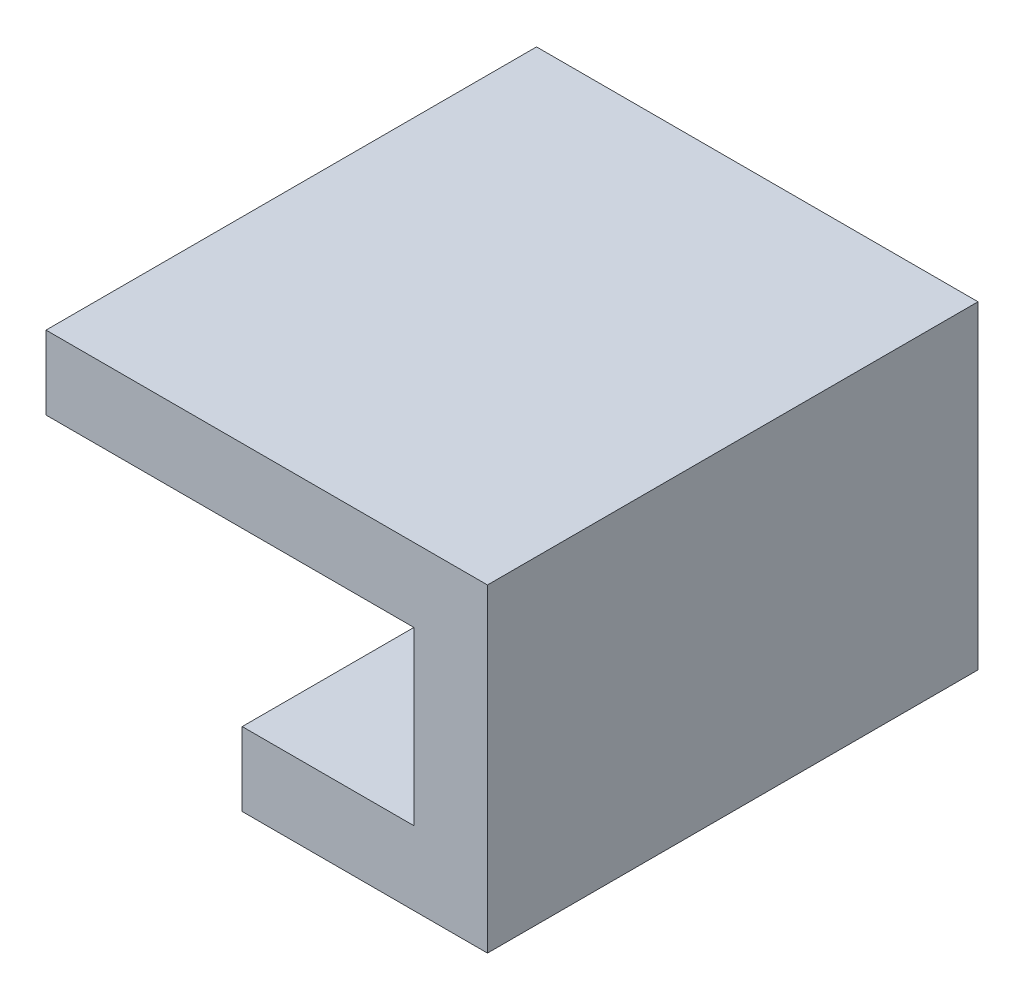
ISO-10303-21;
HEADER;
FILE_DESCRIPTION(('STEP AP214'),'2;1');
FILE_NAME('part.step','',(''),(''),'','','');
FILE_SCHEMA(('AUTOMOTIVE_DESIGN { 1 0 10303 214 1 1 1 1 }'));
ENDSEC;
DATA;
#1=APPLICATION_CONTEXT('core data for automotive mechanical design processes');
#2=APPLICATION_PROTOCOL_DEFINITION('international standard','automotive_design',2000,#1);
#3=PRODUCT_CONTEXT('',#1,'mechanical');
#4=PRODUCT('Part','Part','',(#3));
#5=PRODUCT_RELATED_PRODUCT_CATEGORY('part','',(#4));
#6=PRODUCT_DEFINITION_FORMATION('','',#4);
#7=PRODUCT_DEFINITION_CONTEXT('part definition',#1,'design');
#8=PRODUCT_DEFINITION('design','',#6,#7);
#9=PRODUCT_DEFINITION_SHAPE('','',#8);
#10=(LENGTH_UNIT() NAMED_UNIT(*) SI_UNIT(.MILLI.,.METRE.));
#11=(NAMED_UNIT(*) PLANE_ANGLE_UNIT() SI_UNIT($,.RADIAN.));
#12=(NAMED_UNIT(*) SI_UNIT($,.STERADIAN.) SOLID_ANGLE_UNIT());
#13=UNCERTAINTY_MEASURE_WITH_UNIT(LENGTH_MEASURE(1.E-05),#10,'distance_accuracy_value','');
#14=(GEOMETRIC_REPRESENTATION_CONTEXT(3) GLOBAL_UNCERTAINTY_ASSIGNED_CONTEXT((#13)) GLOBAL_UNIT_ASSIGNED_CONTEXT((#10,
#11,#12)) REPRESENTATION_CONTEXT('',''));
#15=CARTESIAN_POINT('',(0.,0.,0.));
#16=DIRECTION('',(0.,0.,1.));
#17=DIRECTION('',(1.,0.,0.));
#18=AXIS2_PLACEMENT_3D('',#15,#16,#17);
#19=CARTESIAN_POINT('',(194.687130801062,-60.8116928073628,10.));
#20=DIRECTION('',(-1.,0.,0.));
#21=DIRECTION('',(0.,0.,1.));
#22=AXIS2_PLACEMENT_3D('',#19,#20,#21);
#23=PLANE('',#22);
#24=DIRECTION('',(0.,1.,0.));
#25=VECTOR('',#24,1.);
#26=CARTESIAN_POINT('',(194.687130801062,-60.8116928073628,0.));
#27=LINE('',#26,#25);
#28=CARTESIAN_POINT('',(194.687130801062,-60.8116928073628,0.));
#29=VERTEX_POINT('',#28);
#30=CARTESIAN_POINT('',(194.687130801062,-57.3116928073628,0.));
#31=VERTEX_POINT('',#30);
#32=EDGE_CURVE('E144',#29,#31,#27,.T.);
#33=ORIENTED_EDGE('',*,*,#32,.F.);
#34=DIRECTION('',(0.,0.,-1.));
#35=VECTOR('',#34,1.);
#36=CARTESIAN_POINT('',(194.687130801062,-60.8116928073628,10.));
#37=LINE('',#36,#35);
#38=CARTESIAN_POINT('',(194.687130801062,-60.8116928073628,10.));
#39=VERTEX_POINT('',#38);
#40=EDGE_CURVE('E11',#39,#29,#37,.T.);
#41=ORIENTED_EDGE('',*,*,#40,.F.);
#42=DIRECTION('',(0.,1.,0.));
#43=VECTOR('',#42,1.);
#44=CARTESIAN_POINT('',(194.687130801062,-60.8116928073628,10.));
#45=LINE('',#44,#43);
#46=CARTESIAN_POINT('',(194.687130801062,-57.3116928073628,10.));
#47=VERTEX_POINT('',#46);
#48=EDGE_CURVE('E171',#39,#47,#45,.T.);
#49=ORIENTED_EDGE('',*,*,#48,.T.);
#50=DIRECTION('',(0.,0.,-1.));
#51=VECTOR('',#50,1.);
#52=CARTESIAN_POINT('',(194.687130801062,-57.3116928073628,10.));
#53=LINE('',#52,#51);
#54=EDGE_CURVE('E48',#47,#31,#53,.T.);
#55=ORIENTED_EDGE('',*,*,#54,.T.);
#56=EDGE_LOOP('',(#33,#41,#49,#55));
#57=FACE_BOUND('',#56,.T.);
#58=ADVANCED_FACE('F45',(#57),#23,.T.);
#59=CARTESIAN_POINT('',(191.187130801062,-60.8116928073628,10.));
#60=DIRECTION('',(0.,1.,0.));
#61=DIRECTION('',(0.,0.,1.));
#62=AXIS2_PLACEMENT_3D('',#59,#60,#61);
#63=PLANE('',#62);
#64=DIRECTION('',(1.,0.,0.));
#65=VECTOR('',#64,1.);
#66=CARTESIAN_POINT('',(191.187130801062,-60.8116928073628,0.));
#67=LINE('',#66,#65);
#68=CARTESIAN_POINT('',(191.187130801062,-60.8116928073628,0.));
#69=VERTEX_POINT('',#68);
#70=EDGE_CURVE('E168',#69,#29,#67,.T.);
#71=ORIENTED_EDGE('',*,*,#70,.F.);
#72=DIRECTION('',(0.,0.,-1.));
#73=VECTOR('',#72,1.);
#74=CARTESIAN_POINT('',(191.187130801062,-60.8116928073628,10.));
#75=LINE('',#74,#73);
#76=CARTESIAN_POINT('',(191.187130801062,-60.8116928073628,10.));
#77=VERTEX_POINT('',#76);
#78=EDGE_CURVE('E55',#77,#69,#75,.T.);
#79=ORIENTED_EDGE('',*,*,#78,.F.);
#80=DIRECTION('',(1.,0.,0.));
#81=VECTOR('',#80,1.);
#82=CARTESIAN_POINT('',(191.187130801062,-60.8116928073628,10.));
#83=LINE('',#82,#81);
#84=EDGE_CURVE('E137',#77,#39,#83,.T.);
#85=ORIENTED_EDGE('',*,*,#84,.T.);
#86=ORIENTED_EDGE('',*,*,#40,.T.);
#87=EDGE_LOOP('',(#71,#79,#85,#86));
#88=FACE_BOUND('',#87,.T.);
#89=ADVANCED_FACE('F190',(#88),#63,.T.);
#90=CARTESIAN_POINT('',(191.187130801062,-62.3116928073628,10.));
#91=DIRECTION('',(-1.,0.,0.));
#92=DIRECTION('',(0.,0.,1.));
#93=AXIS2_PLACEMENT_3D('',#90,#91,#92);
#94=PLANE('',#93);
#95=DIRECTION('',(0.,1.,0.));
#96=VECTOR('',#95,1.);
#97=CARTESIAN_POINT('',(191.187130801062,-62.3116928073628,0.));
#98=LINE('',#97,#96);
#99=CARTESIAN_POINT('',(191.187130801062,-62.3116928073628,0.));
#100=VERTEX_POINT('',#99);
#101=EDGE_CURVE('E121',#100,#69,#98,.T.);
#102=ORIENTED_EDGE('',*,*,#101,.F.);
#103=DIRECTION('',(0.,0.,-1.));
#104=VECTOR('',#103,1.);
#105=CARTESIAN_POINT('',(191.187130801062,-62.3116928073628,10.));
#106=LINE('',#105,#104);
#107=CARTESIAN_POINT('',(191.187130801062,-62.3116928073628,10.));
#108=VERTEX_POINT('',#107);
#109=EDGE_CURVE('E115',#108,#100,#106,.T.);
#110=ORIENTED_EDGE('',*,*,#109,.F.);
#111=DIRECTION('',(0.,1.,0.));
#112=VECTOR('',#111,1.);
#113=CARTESIAN_POINT('',(191.187130801062,-62.3116928073628,10.));
#114=LINE('',#113,#112);
#115=EDGE_CURVE('E119',#108,#77,#114,.T.);
#116=ORIENTED_EDGE('',*,*,#115,.T.);
#117=ORIENTED_EDGE('',*,*,#78,.T.);
#118=EDGE_LOOP('',(#102,#110,#116,#117));
#119=FACE_BOUND('',#118,.T.);
#120=ADVANCED_FACE('F117',(#119),#94,.T.);
#121=CARTESIAN_POINT('',(191.187130801062,-62.3116928073628,10.));
#122=DIRECTION('',(0.,1.,0.));
#123=DIRECTION('',(0.,0.,1.));
#124=AXIS2_PLACEMENT_3D('',#121,#122,#123);
#125=PLANE('',#124);
#126=DIRECTION('',(1.,0.,0.));
#127=VECTOR('',#126,1.);
#128=CARTESIAN_POINT('',(191.187130801062,-62.3116928073628,0.));
#129=LINE('',#128,#127);
#130=CARTESIAN_POINT('',(196.187130801062,-62.3116928073628,0.));
#131=VERTEX_POINT('',#130);
#132=EDGE_CURVE('E163',#100,#131,#129,.T.);
#133=ORIENTED_EDGE('',*,*,#132,.T.);
#134=DIRECTION('',(0.,0.,-1.));
#135=VECTOR('',#134,1.);
#136=CARTESIAN_POINT('',(196.187130801062,-62.3116928073628,10.));
#137=LINE('',#136,#135);
#138=CARTESIAN_POINT('',(196.187130801062,-62.3116928073628,10.));
#139=VERTEX_POINT('',#138);
#140=EDGE_CURVE('E125',#139,#131,#137,.T.);
#141=ORIENTED_EDGE('',*,*,#140,.F.);
#142=DIRECTION('',(1.,0.,0.));
#143=VECTOR('',#142,1.);
#144=CARTESIAN_POINT('',(191.187130801062,-62.3116928073628,10.));
#145=LINE('',#144,#143);
#146=EDGE_CURVE('E128',#108,#139,#145,.T.);
#147=ORIENTED_EDGE('',*,*,#146,.F.);
#148=ORIENTED_EDGE('',*,*,#109,.T.);
#149=EDGE_LOOP('',(#133,#141,#147,#148));
#150=FACE_BOUND('',#149,.T.);
#151=ADVANCED_FACE('F129',(#150),#125,.F.);
#152=CARTESIAN_POINT('',(196.187130801062,-62.3116928073628,10.));
#153=DIRECTION('',(-1.,0.,0.));
#154=DIRECTION('',(0.,0.,1.));
#155=AXIS2_PLACEMENT_3D('',#152,#153,#154);
#156=PLANE('',#155);
#157=DIRECTION('',(0.,1.,0.));
#158=VECTOR('',#157,1.);
#159=CARTESIAN_POINT('',(196.187130801062,-62.3116928073628,0.));
#160=LINE('',#159,#158);
#161=CARTESIAN_POINT('',(196.187130801062,-55.8116928073628,0.));
#162=VERTEX_POINT('',#161);
#163=EDGE_CURVE('E160',#131,#162,#160,.T.);
#164=ORIENTED_EDGE('',*,*,#163,.T.);
#165=DIRECTION('',(0.,0.,-1.));
#166=VECTOR('',#165,1.);
#167=CARTESIAN_POINT('',(196.187130801062,-55.8116928073628,10.));
#168=LINE('',#167,#166);
#169=CARTESIAN_POINT('',(196.187130801062,-55.8116928073628,10.));
#170=VERTEX_POINT('',#169);
#171=EDGE_CURVE('E177',#170,#162,#168,.T.);
#172=ORIENTED_EDGE('',*,*,#171,.F.);
#173=DIRECTION('',(0.,1.,0.));
#174=VECTOR('',#173,1.);
#175=CARTESIAN_POINT('',(196.187130801062,-62.3116928073628,10.));
#176=LINE('',#175,#174);
#177=EDGE_CURVE('E134',#139,#170,#176,.T.);
#178=ORIENTED_EDGE('',*,*,#177,.F.);
#179=ORIENTED_EDGE('',*,*,#140,.T.);
#180=EDGE_LOOP('',(#164,#172,#178,#179));
#181=FACE_BOUND('',#180,.T.);
#182=ADVANCED_FACE('F203',(#181),#156,.F.);
#183=CARTESIAN_POINT('',(196.187130801062,-55.8116928073628,10.));
#184=DIRECTION('',(0.,-1.,0.));
#185=DIRECTION('',(1.,0.,0.));
#186=AXIS2_PLACEMENT_3D('',#183,#184,#185);
#187=PLANE('',#186);
#188=DIRECTION('',(-1.,0.,0.));
#189=VECTOR('',#188,1.);
#190=CARTESIAN_POINT('',(196.187130801062,-55.8116928073628,0.));
#191=LINE('',#190,#189);
#192=CARTESIAN_POINT('',(187.187130801062,-55.8116928073628,0.));
#193=VERTEX_POINT('',#192);
#194=EDGE_CURVE('E156',#162,#193,#191,.T.);
#195=ORIENTED_EDGE('',*,*,#194,.T.);
#196=DIRECTION('',(0.,0.,-1.));
#197=VECTOR('',#196,1.);
#198=CARTESIAN_POINT('',(187.187130801062,-55.8116928073628,10.));
#199=LINE('',#198,#197);
#200=CARTESIAN_POINT('',(187.187130801062,-55.8116928073628,10.));
#201=VERTEX_POINT('',#200);
#202=EDGE_CURVE('E181',#201,#193,#199,.T.);
#203=ORIENTED_EDGE('',*,*,#202,.F.);
#204=DIRECTION('',(-1.,0.,0.));
#205=VECTOR('',#204,1.);
#206=CARTESIAN_POINT('',(196.187130801062,-55.8116928073628,10.));
#207=LINE('',#206,#205);
#208=EDGE_CURVE('E282',#170,#201,#207,.T.);
#209=ORIENTED_EDGE('',*,*,#208,.F.);
#210=ORIENTED_EDGE('',*,*,#171,.T.);
#211=EDGE_LOOP('',(#195,#203,#209,#210));
#212=FACE_BOUND('',#211,.T.);
#213=ADVANCED_FACE('F206',(#212),#187,.F.);
#214=CARTESIAN_POINT('',(187.187130801062,-57.3116928073628,10.));
#215=DIRECTION('',(-1.,0.,0.));
#216=DIRECTION('',(0.,0.,1.));
#217=AXIS2_PLACEMENT_3D('',#214,#215,#216);
#218=PLANE('',#217);
#219=DIRECTION('',(0.,1.,0.));
#220=VECTOR('',#219,1.);
#221=CARTESIAN_POINT('',(187.187130801062,-57.3116928073628,0.));
#222=LINE('',#221,#220);
#223=CARTESIAN_POINT('',(187.187130801062,-57.3116928073628,0.));
#224=VERTEX_POINT('',#223);
#225=EDGE_CURVE('E152',#224,#193,#222,.T.);
#226=ORIENTED_EDGE('',*,*,#225,.F.);
#227=DIRECTION('',(0.,0.,-1.));
#228=VECTOR('',#227,1.);
#229=CARTESIAN_POINT('',(187.187130801062,-57.3116928073628,10.));
#230=LINE('',#229,#228);
#231=CARTESIAN_POINT('',(187.187130801062,-57.3116928073628,10.));
#232=VERTEX_POINT('',#231);
#233=EDGE_CURVE('E183',#232,#224,#230,.T.);
#234=ORIENTED_EDGE('',*,*,#233,.F.);
#235=DIRECTION('',(0.,1.,0.));
#236=VECTOR('',#235,1.);
#237=CARTESIAN_POINT('',(187.187130801062,-57.3116928073628,10.));
#238=LINE('',#237,#236);
#239=EDGE_CURVE('E285',#232,#201,#238,.T.);
#240=ORIENTED_EDGE('',*,*,#239,.T.);
#241=ORIENTED_EDGE('',*,*,#202,.T.);
#242=EDGE_LOOP('',(#226,#234,#240,#241));
#243=FACE_BOUND('',#242,.T.);
#244=ADVANCED_FACE('F210',(#243),#218,.T.);
#245=CARTESIAN_POINT('',(194.687130801062,-57.3116928073628,10.));
#246=DIRECTION('',(0.,-1.,0.));
#247=DIRECTION('',(0.,0.,-1.));
#248=AXIS2_PLACEMENT_3D('',#245,#246,#247);
#249=PLANE('',#248);
#250=DIRECTION('',(-1.,0.,0.));
#251=VECTOR('',#250,1.);
#252=CARTESIAN_POINT('',(194.687130801062,-57.3116928073628,0.));
#253=LINE('',#252,#251);
#254=EDGE_CURVE('E148',#31,#224,#253,.T.);
#255=ORIENTED_EDGE('',*,*,#254,.F.);
#256=ORIENTED_EDGE('',*,*,#54,.F.);
#257=DIRECTION('',(-1.,0.,0.));
#258=VECTOR('',#257,1.);
#259=CARTESIAN_POINT('',(194.687130801062,-57.3116928073628,10.));
#260=LINE('',#259,#258);
#261=EDGE_CURVE('E290',#47,#232,#260,.T.);
#262=ORIENTED_EDGE('',*,*,#261,.T.);
#263=ORIENTED_EDGE('',*,*,#233,.T.);
#264=EDGE_LOOP('',(#255,#256,#262,#263));
#265=FACE_BOUND('',#264,.T.);
#266=ADVANCED_FACE('F187',(#265),#249,.T.);
#267=CARTESIAN_POINT('',(0.,0.,10.));
#268=DIRECTION('',(0.,0.,1.));
#269=DIRECTION('',(1.,0.,0.));
#270=AXIS2_PLACEMENT_3D('',#267,#268,#269);
#271=PLANE('',#270);
#272=ORIENTED_EDGE('',*,*,#48,.F.);
#273=ORIENTED_EDGE('',*,*,#84,.F.);
#274=ORIENTED_EDGE('',*,*,#115,.F.);
#275=ORIENTED_EDGE('',*,*,#146,.T.);
#276=ORIENTED_EDGE('',*,*,#177,.T.);
#277=ORIENTED_EDGE('',*,*,#208,.T.);
#278=ORIENTED_EDGE('',*,*,#239,.F.);
#279=ORIENTED_EDGE('',*,*,#261,.F.);
#280=EDGE_LOOP('',(#272,#273,#274,#275,#276,#277,#278,#279));
#281=FACE_BOUND('',#280,.T.);
#282=ADVANCED_FACE('F136',(#281),#271,.T.);
#283=CARTESIAN_POINT('',(0.,0.,0.));
#284=DIRECTION('',(0.,0.,1.));
#285=DIRECTION('',(1.,0.,0.));
#286=AXIS2_PLACEMENT_3D('',#283,#284,#285);
#287=PLANE('',#286);
#288=ORIENTED_EDGE('',*,*,#32,.T.);
#289=ORIENTED_EDGE('',*,*,#254,.T.);
#290=ORIENTED_EDGE('',*,*,#225,.T.);
#291=ORIENTED_EDGE('',*,*,#194,.F.);
#292=ORIENTED_EDGE('',*,*,#163,.F.);
#293=ORIENTED_EDGE('',*,*,#132,.F.);
#294=ORIENTED_EDGE('',*,*,#101,.T.);
#295=ORIENTED_EDGE('',*,*,#70,.T.);
#296=EDGE_LOOP('',(#288,#289,#290,#291,#292,#293,#294,#295));
#297=FACE_BOUND('',#296,.T.);
#298=ADVANCED_FACE('F189',(#297),#287,.F.);
#299=CLOSED_SHELL('',(#58,#89,#120,#151,#182,#213,#244,#266,#282,#298));
#300=MANIFOLD_SOLID_BREP('B2',#299);
#301=ADVANCED_BREP_SHAPE_REPRESENTATION('',(#18,#300),#14);
#302=SHAPE_DEFINITION_REPRESENTATION(#9,#301);
ENDSEC;
END-ISO-10303-21;
